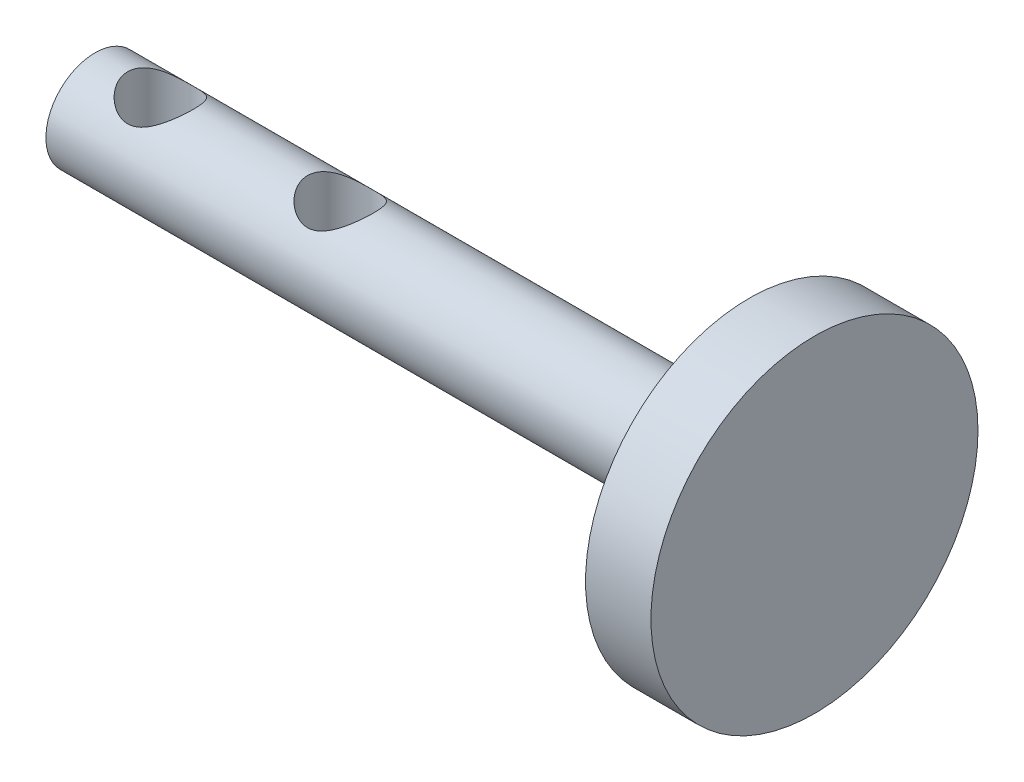
ISO-10303-21;
HEADER;
FILE_DESCRIPTION(('STEP AP214'),'2;1');
FILE_NAME('part.step','',(''),(''),'','','');
FILE_SCHEMA(('AUTOMOTIVE_DESIGN { 1 0 10303 214 1 1 1 1 }'));
ENDSEC;
DATA;
#1=APPLICATION_CONTEXT('core data for automotive mechanical design processes');
#2=APPLICATION_PROTOCOL_DEFINITION('international standard','automotive_design',2000,#1);
#3=PRODUCT_CONTEXT('',#1,'mechanical');
#4=PRODUCT('Part','Part','',(#3));
#5=PRODUCT_RELATED_PRODUCT_CATEGORY('part','',(#4));
#6=PRODUCT_DEFINITION_FORMATION('','',#4);
#7=PRODUCT_DEFINITION_CONTEXT('part definition',#1,'design');
#8=PRODUCT_DEFINITION('design','',#6,#7);
#9=PRODUCT_DEFINITION_SHAPE('','',#8);
#10=(LENGTH_UNIT() NAMED_UNIT(*) SI_UNIT(.MILLI.,.METRE.));
#11=(NAMED_UNIT(*) PLANE_ANGLE_UNIT() SI_UNIT($,.RADIAN.));
#12=(NAMED_UNIT(*) SI_UNIT($,.STERADIAN.) SOLID_ANGLE_UNIT());
#13=UNCERTAINTY_MEASURE_WITH_UNIT(LENGTH_MEASURE(1.E-05),#10,'distance_accuracy_value','');
#14=(GEOMETRIC_REPRESENTATION_CONTEXT(3) GLOBAL_UNCERTAINTY_ASSIGNED_CONTEXT((#13)) GLOBAL_UNIT_ASSIGNED_CONTEXT((#10,
#11,#12)) REPRESENTATION_CONTEXT('',''));
#15=CARTESIAN_POINT('',(0.,0.,0.));
#16=DIRECTION('',(0.,0.,1.));
#17=DIRECTION('',(1.,0.,0.));
#18=AXIS2_PLACEMENT_3D('',#15,#16,#17);
#19=CARTESIAN_POINT('',(20.,0.,0.));
#20=DIRECTION('',(-1.,0.,0.));
#21=DIRECTION('',(0.,0.,1.));
#22=AXIS2_PLACEMENT_3D('',#19,#20,#21);
#23=CYLINDRICAL_SURFACE('',#22,1.5);
#24=CARTESIAN_POINT('',(2.,-1.1180339887499,1.));
#25=CARTESIAN_POINT('',(2.04881415543431,-1.11803876731408,0.999997269988656));
#26=CARTESIAN_POINT('',(2.0976453768544,-1.12129035523721,0.99639496251832));
#27=CARTESIAN_POINT('',(2.19355995582541,-1.13365986250808,0.982291341588655));
#28=CARTESIAN_POINT('',(2.24064001776478,-1.14278830406355,0.971777652939312));
#29=CARTESIAN_POINT('',(2.33136772093884,-1.16528292912785,0.94467930838316));
#30=CARTESIAN_POINT('',(2.37504384836883,-1.17860780897301,0.92815359007107));
#31=CARTESIAN_POINT('',(2.45893291617333,-1.20792047340913,0.889670041967692));
#32=CARTESIAN_POINT('',(2.49914513498824,-1.22390881079415,0.867711084060814));
#33=CARTESIAN_POINT('',(2.58182344380845,-1.25973036466013,0.815012050038569));
#34=CARTESIAN_POINT('',(2.6236660588586,-1.27977468045182,0.783437177258661));
#35=CARTESIAN_POINT('',(2.70200135443714,-1.31972413654041,0.7140960987034));
#36=CARTESIAN_POINT('',(2.73848876082926,-1.33962912148992,0.676323865885401));
#37=CARTESIAN_POINT('',(2.81032182939083,-1.38044409261874,0.589078452471478));
#38=CARTESIAN_POINT('',(2.84474125588784,-1.40108392923461,0.538703219829095));
#39=CARTESIAN_POINT('',(2.90432104774504,-1.43779242241382,0.431235482106116));
#40=CARTESIAN_POINT('',(2.9294917570156,-1.45386618115518,0.374150576160852));
#41=CARTESIAN_POINT('',(2.96677820050873,-1.47799953732363,0.261624536740002));
#42=CARTESIAN_POINT('',(2.98004167224778,-1.48675587807934,0.206717362590708));
#43=CARTESIAN_POINT('',(2.99709224464182,-1.49804872730961,0.0948477243649312));
#44=CARTESIAN_POINT('',(3.00089127961272,-1.5005930688118,0.0378879406429128));
#45=CARTESIAN_POINT('',(2.99891377502547,-1.49927680861477,-0.0670735251161645));
#46=CARTESIAN_POINT('',(2.99450547434147,-1.49633132455064,-0.115120319004376));
#47=CARTESIAN_POINT('',(2.97895447432055,-1.4860409139501,-0.209619316635508));
#48=CARTESIAN_POINT('',(2.96781128384823,-1.47869566656551,-0.256071403824862));
#49=CARTESIAN_POINT('',(2.93940215760271,-1.46026045851868,-0.346038968835584));
#50=CARTESIAN_POINT('',(2.92216055740072,-1.44918538991339,-0.389565311922981));
#51=CARTESIAN_POINT('',(2.88222317852359,-1.42410552238144,-0.473104575326778));
#52=CARTESIAN_POINT('',(2.85952640424924,-1.41010018872581,-0.513116852484701));
#53=CARTESIAN_POINT('',(2.80601063127005,-1.37809029225351,-0.59414214598172));
#54=CARTESIAN_POINT('',(2.77451623832361,-1.35980204396013,-0.634595740498538));
#55=CARTESIAN_POINT('',(2.70605066025984,-1.32200300913499,-0.709994037491523));
#56=CARTESIAN_POINT('',(2.66907102703309,-1.30249036407616,-0.744930067597284));
#57=CARTESIAN_POINT('',(2.58401839489336,-1.26075022472076,-0.813861176630826));
#58=CARTESIAN_POINT('',(2.53511446014276,-1.23857160004468,-0.846867965631777));
#59=CARTESIAN_POINT('',(2.43124508038964,-1.19737805415546,-0.904174374727408));
#60=CARTESIAN_POINT('',(2.37629000279303,-1.17835785767438,-0.92848859327447));
#61=CARTESIAN_POINT('',(2.27764046896346,-1.15131435153449,-0.961663622838891));
#62=CARTESIAN_POINT('',(2.23520331497161,-1.1417018228885,-0.972953958737704));
#63=CARTESIAN_POINT('',(2.14848025509154,-1.1270451989479,-0.98989777790003));
#64=CARTESIAN_POINT('',(2.10419769441354,-1.12199318391119,-0.995561034821826));
#65=CARTESIAN_POINT('',(2.01477850677941,-1.11723778493745,-1.00089700074453));
#66=CARTESIAN_POINT('',(1.96963901074052,-1.11755766933454,-1.00054364876605));
#67=CARTESIAN_POINT('',(1.8801580830219,-1.12354940184257,-0.993808148581262));
#68=CARTESIAN_POINT('',(1.83581732794414,-1.12922558823607,-0.987421113449807));
#69=CARTESIAN_POINT('',(1.75130529122714,-1.14463988751152,-0.969499055937227));
#70=CARTESIAN_POINT('',(1.71103614550622,-1.15416593537715,-0.958230872657146));
#71=CARTESIAN_POINT('',(1.63293688196734,-1.17614979263984,-0.931115208135283));
#72=CARTESIAN_POINT('',(1.5951075884905,-1.18860858636727,-0.915266188999619));
#73=CARTESIAN_POINT('',(1.51489899811163,-1.21805741810736,-0.875816733031264));
#74=CARTESIAN_POINT('',(1.47312159436905,-1.23545540768822,-0.851300144226031));
#75=CARTESIAN_POINT('',(1.39379159883503,-1.27131257456476,-0.79676365764559));
#76=CARTESIAN_POINT('',(1.35624424167058,-1.2897730248931,-0.76673705945938));
#77=CARTESIAN_POINT('',(1.27801882621476,-1.33037839141598,-0.694383288512649));
#78=CARTESIAN_POINT('',(1.23844857586215,-1.35244726064259,-0.650801932557864));
#79=CARTESIAN_POINT('',(1.16709165854353,-1.39387790925842,-0.556549744344257));
#80=CARTESIAN_POINT('',(1.13529811437494,-1.41324207395941,-0.505885238731679));
#81=CARTESIAN_POINT('',(1.08605413053854,-1.44395410620131,-0.408743737408334));
#82=CARTESIAN_POINT('',(1.0670217477791,-1.45612729055242,-0.363331182442474));
#83=CARTESIAN_POINT('',(1.03569640284049,-1.47639353933783,-0.269378539510946));
#84=CARTESIAN_POINT('',(1.02339774857031,-1.48449004936067,-0.220841131929571));
#85=CARTESIAN_POINT('',(1.00615151808043,-1.49589182013302,-0.121684696151538));
#86=CARTESIAN_POINT('',(1.00123666024661,-1.49917575428247,-0.0710574184621111));
#87=CARTESIAN_POINT('',(0.999176074291499,-1.50054910514547,0.0304277732903151));
#88=CARTESIAN_POINT('',(1.00202962402193,-1.49863900469456,0.0812856654767095));
#89=CARTESIAN_POINT('',(1.01482974450234,-1.49014777988657,0.177878766264063));
#90=CARTESIAN_POINT('',(1.0242454924309,-1.48391638604927,0.223717571535267));
#91=CARTESIAN_POINT('',(1.04911900471545,-1.46768053103468,0.313009211498526));
#92=CARTESIAN_POINT('',(1.06457770767363,-1.45767548373552,0.356461674343443));
#93=CARTESIAN_POINT('',(1.10196935244201,-1.43395882743097,0.442573648304175));
#94=CARTESIAN_POINT('',(1.12422515374754,-1.42006624473169,0.485041794600131));
#95=CARTESIAN_POINT('',(1.17407532231299,-1.38987704117736,0.56577633134159));
#96=CARTESIAN_POINT('',(1.201672883976,-1.37357898322632,0.604040186025008));
#97=CARTESIAN_POINT('',(1.26631445116815,-1.33696465736197,0.681647111007009));
#98=CARTESIAN_POINT('',(1.30416151183702,-1.31641956938685,0.720213397630455));
#99=CARTESIAN_POINT('',(1.38555677077292,-1.27526678824743,0.790800111407977));
#100=CARTESIAN_POINT('',(1.42910919441705,-1.25465905985077,0.822815641619615));
#101=CARTESIAN_POINT('',(1.51793379537764,-1.21692106795149,0.877566267592055));
#102=CARTESIAN_POINT('',(1.56282090497517,-1.19964543370952,0.90082323448605));
#103=CARTESIAN_POINT('',(1.65664222449658,-1.16873750795511,0.940579011701362));
#104=CARTESIAN_POINT('',(1.70556834693108,-1.15509815647652,0.957090951406665));
#105=CARTESIAN_POINT('',(1.79538573421227,-1.1359552596477,0.979681312354539));
#106=CARTESIAN_POINT('',(1.83565411839515,-1.12931847705076,0.987261141866242));
#107=CARTESIAN_POINT('',(1.91727820025227,-1.12035759608004,0.997419579094631));
#108=CARTESIAN_POINT('',(1.95863297213029,-1.11802993920738,1.00000231351858));
#109=CARTESIAN_POINT('',(2.,-1.1180339887499,1.));
#110=B_SPLINE_CURVE_WITH_KNOTS('',3,(#24,#25,#26,#27,#28,#29,#30,#31,#32,#33,#34,#35,#36,#37,
#38,#39,#40,#41,#42,#43,#44,#45,#46,#47,#48,#49,#50,#51,#52,#53,#54,#55,#56,#57,#58,#59,#60,#61,
#62,#63,#64,#65,#66,#67,#68,#69,#70,#71,#72,#73,#74,#75,#76,#77,#78,#79,#80,#81,#82,#83,#84,#85,
#86,#87,#88,#89,#90,#91,#92,#93,#94,#95,#96,#97,#98,#99,#100,#101,#102,#103,#104,#105,#106,#107,
#108,#109),.UNSPECIFIED.,.T.,.F.,(4,2,2,2,2,2,2,2,2,2,2,2,2,2,2,2,2,2,2,2,2,2,2,2,2,2,2,2,2,2,2,
2,2,2,2,2,2,2,2,2,2,2,4),(0.,0.146253465361076,0.292769521129644,0.437886325608137,
0.583033286332745,0.750773385343188,0.918677592181377,1.11083515503145,1.3027771469429,
1.4731874103179,1.64338268344149,1.78769767477871,1.93202319141873,2.07577915986595,
2.219561384515,2.38223762973317,2.54516707398319,2.73339351752472,2.92130234871974,
3.05563045200662,3.18972483117743,3.32440018819018,3.45918471785299,3.58738225853468,
3.71562288822479,3.86949615025543,4.0235577839993,4.21127342259657,4.39882245285466,
4.55035290305025,4.70175506443412,4.85382614632258,5.00588309222248,5.1468839112404,
5.28790663945594,5.43708931492125,5.58636147964719,5.75911103141433,5.93198925208478,
6.09167062897535,6.25103968323789,6.37508308151304,6.49902399831892),.UNSPECIFIED.);
#111=CARTESIAN_POINT('',(2.,-1.1180339887499,1.));
#112=VERTEX_POINT('',#111);
#113=EDGE_CURVE('E39',#112,#112,#110,.T.);
#114=ORIENTED_EDGE('',*,*,#113,.T.);
#115=EDGE_LOOP('',(#114));
#116=FACE_BOUND('',#115,.T.);
#117=CARTESIAN_POINT('',(2.,1.1180339887499,1.));
#118=CARTESIAN_POINT('',(1.95118584456569,1.11803876731408,0.999997269988656));
#119=CARTESIAN_POINT('',(1.9023546231456,1.12129035523721,0.99639496251832));
#120=CARTESIAN_POINT('',(1.80644004417459,1.13365986250808,0.982291341588655));
#121=CARTESIAN_POINT('',(1.75935998223522,1.14278830406355,0.971777652939312));
#122=CARTESIAN_POINT('',(1.66863227906116,1.16528292912785,0.94467930838316));
#123=CARTESIAN_POINT('',(1.62495615163117,1.17860780897301,0.92815359007107));
#124=CARTESIAN_POINT('',(1.54106708382667,1.20792047340913,0.889670041967692));
#125=CARTESIAN_POINT('',(1.50085486501176,1.22390881079415,0.867711084060814));
#126=CARTESIAN_POINT('',(1.41817655619155,1.25973036466013,0.815012050038568));
#127=CARTESIAN_POINT('',(1.3763339411414,1.27977468045182,0.783437177258661));
#128=CARTESIAN_POINT('',(1.29799864556286,1.31972413654041,0.714096098703399));
#129=CARTESIAN_POINT('',(1.26151123917074,1.33962912148992,0.6763238658854));
#130=CARTESIAN_POINT('',(1.18967817060917,1.38044409261874,0.589078452471477));
#131=CARTESIAN_POINT('',(1.15525874411216,1.40108392923461,0.538703219829095));
#132=CARTESIAN_POINT('',(1.09567895225496,1.43779242241382,0.431235482106116));
#133=CARTESIAN_POINT('',(1.0705082429844,1.45386618115518,0.374150576160852));
#134=CARTESIAN_POINT('',(1.03322179949127,1.47799953732363,0.261624536740001));
#135=CARTESIAN_POINT('',(1.01995832775222,1.48675587807934,0.206717362590708));
#136=CARTESIAN_POINT('',(1.00290775535818,1.49804872730961,0.0948477243649308));
#137=CARTESIAN_POINT('',(0.999108720387279,1.5005930688118,0.0378879406429124));
#138=CARTESIAN_POINT('',(1.00108622497453,1.49927680861477,-0.0670735251161649));
#139=CARTESIAN_POINT('',(1.00549452565853,1.49633132455064,-0.115120319004377));
#140=CARTESIAN_POINT('',(1.02104552567945,1.4860409139501,-0.209619316635508));
#141=CARTESIAN_POINT('',(1.03218871615177,1.47869566656551,-0.256071403824862));
#142=CARTESIAN_POINT('',(1.06059784239729,1.46026045851868,-0.346038968835585));
#143=CARTESIAN_POINT('',(1.07783944259928,1.44918538991339,-0.389565311922981));
#144=CARTESIAN_POINT('',(1.11777682147641,1.42410552238144,-0.473104575326778));
#145=CARTESIAN_POINT('',(1.14047359575076,1.41010018872581,-0.513116852484701));
#146=CARTESIAN_POINT('',(1.19398936872995,1.37809029225351,-0.59414214598172));
#147=CARTESIAN_POINT('',(1.22548376167639,1.35980204396012,-0.634595740498539));
#148=CARTESIAN_POINT('',(1.29394933974016,1.32200300913499,-0.709994037491523));
#149=CARTESIAN_POINT('',(1.33092897296691,1.30249036407616,-0.744930067597285));
#150=CARTESIAN_POINT('',(1.41598160510664,1.26075022472076,-0.813861176630826));
#151=CARTESIAN_POINT('',(1.46488553985724,1.23857160004468,-0.846867965631777));
#152=CARTESIAN_POINT('',(1.56875491961036,1.19737805415546,-0.904174374727408));
#153=CARTESIAN_POINT('',(1.62370999720697,1.17835785767438,-0.928488593274471));
#154=CARTESIAN_POINT('',(1.72235953103654,1.15131435153449,-0.961663622838891));
#155=CARTESIAN_POINT('',(1.7647966850284,1.1417018228885,-0.972953958737705));
#156=CARTESIAN_POINT('',(1.85151974490846,1.1270451989479,-0.98989777790003));
#157=CARTESIAN_POINT('',(1.89580230558646,1.12199318391119,-0.995561034821826));
#158=CARTESIAN_POINT('',(1.98522149322059,1.11723778493745,-1.00089700074453));
#159=CARTESIAN_POINT('',(2.03036098925948,1.11755766933454,-1.00054364876605));
#160=CARTESIAN_POINT('',(2.1198419169781,1.12354940184257,-0.993808148581262));
#161=CARTESIAN_POINT('',(2.16418267205586,1.12922558823607,-0.987421113449806));
#162=CARTESIAN_POINT('',(2.24869470877286,1.14463988751152,-0.969499055937226));
#163=CARTESIAN_POINT('',(2.28896385449378,1.15416593537715,-0.958230872657146));
#164=CARTESIAN_POINT('',(2.36706311803266,1.17614979263984,-0.931115208135282));
#165=CARTESIAN_POINT('',(2.4048924115095,1.18860858636727,-0.915266188999618));
#166=CARTESIAN_POINT('',(2.48510100188837,1.21805741810736,-0.875816733031263));
#167=CARTESIAN_POINT('',(2.52687840563095,1.23545540768822,-0.851300144226031));
#168=CARTESIAN_POINT('',(2.60620840116498,1.27131257456476,-0.79676365764559));
#169=CARTESIAN_POINT('',(2.64375575832942,1.2897730248931,-0.766737059459379));
#170=CARTESIAN_POINT('',(2.72198117378524,1.33037839141598,-0.694383288512648));
#171=CARTESIAN_POINT('',(2.76155142413785,1.35244726064259,-0.650801932557862));
#172=CARTESIAN_POINT('',(2.83290834145647,1.39387790925842,-0.556549744344254));
#173=CARTESIAN_POINT('',(2.86470188562506,1.41324207395941,-0.505885238731677));
#174=CARTESIAN_POINT('',(2.91394586946146,1.44395410620131,-0.408743737408332));
#175=CARTESIAN_POINT('',(2.9329782522209,1.45612729055242,-0.363331182442473));
#176=CARTESIAN_POINT('',(2.96430359715951,1.47639353933783,-0.269378539510944));
#177=CARTESIAN_POINT('',(2.97660225142969,1.48449004936067,-0.220841131929569));
#178=CARTESIAN_POINT('',(2.99384848191957,1.49589182013302,-0.121684696151536));
#179=CARTESIAN_POINT('',(2.99876333975339,1.49917575428247,-0.0710574184621097));
#180=CARTESIAN_POINT('',(3.0008239257085,1.50054910514547,0.0304277732903163));
#181=CARTESIAN_POINT('',(2.99797037597807,1.49863900469456,0.081285665476711));
#182=CARTESIAN_POINT('',(2.98517025549766,1.49014777988657,0.177878766264065));
#183=CARTESIAN_POINT('',(2.9757545075691,1.48391638604927,0.223717571535269));
#184=CARTESIAN_POINT('',(2.95088099528455,1.46768053103468,0.313009211498528));
#185=CARTESIAN_POINT('',(2.93542229232637,1.45767548373552,0.356461674343444));
#186=CARTESIAN_POINT('',(2.89803064755799,1.43395882743097,0.442573648304176));
#187=CARTESIAN_POINT('',(2.87577484625246,1.42006624473169,0.485041794600133));
#188=CARTESIAN_POINT('',(2.82592467768701,1.38987704117736,0.565776331341591));
#189=CARTESIAN_POINT('',(2.798327116024,1.37357898322632,0.604040186025009));
#190=CARTESIAN_POINT('',(2.73368554883184,1.33696465736197,0.68164711100701));
#191=CARTESIAN_POINT('',(2.69583848816298,1.31641956938685,0.720213397630456));
#192=CARTESIAN_POINT('',(2.61444322922708,1.27526678824743,0.790800111407978));
#193=CARTESIAN_POINT('',(2.57089080558295,1.25465905985077,0.822815641619616));
#194=CARTESIAN_POINT('',(2.48206620462235,1.21692106795149,0.877566267592056));
#195=CARTESIAN_POINT('',(2.43717909502483,1.19964543370952,0.90082323448605));
#196=CARTESIAN_POINT('',(2.34335777550342,1.16873750795511,0.940579011701362));
#197=CARTESIAN_POINT('',(2.29443165306892,1.15509815647652,0.957090951406666));
#198=CARTESIAN_POINT('',(2.20461426578773,1.1359552596477,0.979681312354539));
#199=CARTESIAN_POINT('',(2.16434588160485,1.12931847705076,0.987261141866242));
#200=CARTESIAN_POINT('',(2.08272179974773,1.12035759608004,0.997419579094631));
#201=CARTESIAN_POINT('',(2.04136702786971,1.11802993920738,1.00000231351858));
#202=CARTESIAN_POINT('',(2.,1.1180339887499,1.));
#203=B_SPLINE_CURVE_WITH_KNOTS('',3,(#117,#118,#119,#120,#121,#122,#123,#124,#125,#126,#127,
#128,#129,#130,#131,#132,#133,#134,#135,#136,#137,#138,#139,#140,#141,#142,#143,#144,#145,#146,
#147,#148,#149,#150,#151,#152,#153,#154,#155,#156,#157,#158,#159,#160,#161,#162,#163,#164,#165,
#166,#167,#168,#169,#170,#171,#172,#173,#174,#175,#176,#177,#178,#179,#180,#181,#182,#183,#184,
#185,#186,#187,#188,#189,#190,#191,#192,#193,#194,#195,#196,#197,#198,#199,#200,#201,#202),
.UNSPECIFIED.,.T.,.F.,(4,2,2,2,2,2,2,2,2,2,2,2,2,2,2,2,2,2,2,2,2,2,2,2,2,2,2,2,2,2,2,2,2,2,2,2,
2,2,2,2,2,2,4),(0.,0.146253465361076,0.292769521129644,0.437886325608137,0.583033286332745,
0.750773385343188,0.918677592181377,1.11083515503145,1.3027771469429,1.4731874103179,
1.64338268344149,1.78769767477871,1.93202319141873,2.07577915986595,2.219561384515,
2.38223762973317,2.54516707398319,2.73339351752472,2.92130234871974,3.05563045200662,
3.18972483117743,3.32440018819018,3.45918471785299,3.58738225853468,3.71562288822479,
3.86949615025543,4.0235577839993,4.21127342259657,4.39882245285466,4.55035290305025,
4.70175506443412,4.85382614632258,5.00588309222248,5.1468839112404,5.28790663945594,
5.43708931492125,5.58636147964719,5.75911103141433,5.93198925208478,6.09167062897535,
6.25103968323789,6.37508308151304,6.49902399831892),.UNSPECIFIED.);
#204=CARTESIAN_POINT('',(2.,1.1180339887499,1.));
#205=VERTEX_POINT('',#204);
#206=EDGE_CURVE('E104',#205,#205,#203,.T.);
#207=ORIENTED_EDGE('',*,*,#206,.T.);
#208=EDGE_LOOP('',(#207));
#209=FACE_BOUND('',#208,.T.);
#210=CARTESIAN_POINT('',(7.5,-1.11803398874989,1.));
#211=CARTESIAN_POINT('',(7.54881415543431,-1.11803876731408,0.999997269988657));
#212=CARTESIAN_POINT('',(7.5976453768544,-1.12129035523721,0.996394962518322));
#213=CARTESIAN_POINT('',(7.69355995582541,-1.13365986250808,0.982291341588656));
#214=CARTESIAN_POINT('',(7.74064001776478,-1.14278830406355,0.971777652939313));
#215=CARTESIAN_POINT('',(7.83136772093884,-1.16528292912785,0.944679308383161));
#216=CARTESIAN_POINT('',(7.87504384836883,-1.17860780897301,0.928153590071071));
#217=CARTESIAN_POINT('',(7.95893291617333,-1.20792047340913,0.889670041967693));
#218=CARTESIAN_POINT('',(7.99914513498824,-1.22390881079415,0.867711084060815));
#219=CARTESIAN_POINT('',(8.08182344380845,-1.25973036466013,0.815012050038569));
#220=CARTESIAN_POINT('',(8.1236660588586,-1.27977468045182,0.783437177258662));
#221=CARTESIAN_POINT('',(8.20200135443714,-1.31972413654041,0.7140960987034));
#222=CARTESIAN_POINT('',(8.23848876082926,-1.33962912148992,0.676323865885401));
#223=CARTESIAN_POINT('',(8.31032182939084,-1.38044409261874,0.589078452471478));
#224=CARTESIAN_POINT('',(8.34474125588784,-1.40108392923461,0.538703219829095));
#225=CARTESIAN_POINT('',(8.40432104774504,-1.43779242241382,0.431235482106116));
#226=CARTESIAN_POINT('',(8.4294917570156,-1.45386618115518,0.374150576160852));
#227=CARTESIAN_POINT('',(8.46677820050873,-1.47799953732363,0.261624536740002));
#228=CARTESIAN_POINT('',(8.48004167224778,-1.48675587807934,0.206717362590708));
#229=CARTESIAN_POINT('',(8.49709224464183,-1.49804872730961,0.0948477243649311));
#230=CARTESIAN_POINT('',(8.50089127961272,-1.5005930688118,0.0378879406429125));
#231=CARTESIAN_POINT('',(8.49891377502547,-1.49927680861477,-0.0670735251161649));
#232=CARTESIAN_POINT('',(8.49450547434147,-1.49633132455064,-0.115120319004377));
#233=CARTESIAN_POINT('',(8.47895447432055,-1.4860409139501,-0.209619316635508));
#234=CARTESIAN_POINT('',(8.46781128384823,-1.47869566656551,-0.256071403824862));
#235=CARTESIAN_POINT('',(8.43940215760271,-1.46026045851868,-0.346038968835585));
#236=CARTESIAN_POINT('',(8.42216055740072,-1.44918538991339,-0.389565311922981));
#237=CARTESIAN_POINT('',(8.38222317852359,-1.42410552238144,-0.473104575326779));
#238=CARTESIAN_POINT('',(8.35952640424925,-1.41010018872581,-0.513116852484702));
#239=CARTESIAN_POINT('',(8.30601063127006,-1.37809029225351,-0.594142145981721));
#240=CARTESIAN_POINT('',(8.27451623832361,-1.35980204396012,-0.634595740498539));
#241=CARTESIAN_POINT('',(8.20605066025984,-1.32200300913499,-0.709994037491524));
#242=CARTESIAN_POINT('',(8.16907102703309,-1.30249036407615,-0.744930067597285));
#243=CARTESIAN_POINT('',(8.08401839489336,-1.26075022472076,-0.813861176630827));
#244=CARTESIAN_POINT('',(8.03511446014276,-1.23857160004468,-0.846867965631778));
#245=CARTESIAN_POINT('',(7.93124508038964,-1.19737805415546,-0.904174374727409));
#246=CARTESIAN_POINT('',(7.87629000279303,-1.17835785767438,-0.928488593274472));
#247=CARTESIAN_POINT('',(7.77764046896346,-1.15131435153449,-0.961663622838892));
#248=CARTESIAN_POINT('',(7.7352033149716,-1.14170182288849,-0.972953958737706));
#249=CARTESIAN_POINT('',(7.64848025509154,-1.1270451989479,-0.989897777900031));
#250=CARTESIAN_POINT('',(7.60419769441354,-1.12199318391118,-0.995561034821827));
#251=CARTESIAN_POINT('',(7.51477850677941,-1.11723778493745,-1.00089700074454));
#252=CARTESIAN_POINT('',(7.46963901074052,-1.11755766933454,-1.00054364876605));
#253=CARTESIAN_POINT('',(7.3801580830219,-1.12354940184257,-0.993808148581264));
#254=CARTESIAN_POINT('',(7.33581732794414,-1.12922558823606,-0.987421113449808));
#255=CARTESIAN_POINT('',(7.25130529122714,-1.14463988751152,-0.969499055937228));
#256=CARTESIAN_POINT('',(7.21103614550622,-1.15416593537715,-0.958230872657147));
#257=CARTESIAN_POINT('',(7.13293688196734,-1.17614979263984,-0.931115208135284));
#258=CARTESIAN_POINT('',(7.0951075884905,-1.18860858636727,-0.91526618899962));
#259=CARTESIAN_POINT('',(7.01489899811162,-1.21805741810736,-0.875816733031264));
#260=CARTESIAN_POINT('',(6.97312159436905,-1.23545540768822,-0.851300144226032));
#261=CARTESIAN_POINT('',(6.89379159883502,-1.27131257456476,-0.79676365764559));
#262=CARTESIAN_POINT('',(6.85624424167058,-1.2897730248931,-0.76673705945938));
#263=CARTESIAN_POINT('',(6.77801882621476,-1.33037839141598,-0.694383288512649));
#264=CARTESIAN_POINT('',(6.73844857586215,-1.35244726064259,-0.650801932557863));
#265=CARTESIAN_POINT('',(6.66709165854353,-1.39387790925842,-0.556549744344256));
#266=CARTESIAN_POINT('',(6.63529811437494,-1.41324207395941,-0.505885238731678));
#267=CARTESIAN_POINT('',(6.58605413053854,-1.44395410620131,-0.408743737408333));
#268=CARTESIAN_POINT('',(6.5670217477791,-1.45612729055242,-0.363331182442473));
#269=CARTESIAN_POINT('',(6.53569640284049,-1.47639353933783,-0.269378539510944));
#270=CARTESIAN_POINT('',(6.52339774857031,-1.48449004936067,-0.220841131929569));
#271=CARTESIAN_POINT('',(6.50615151808043,-1.49589182013302,-0.121684696151536));
#272=CARTESIAN_POINT('',(6.50123666024661,-1.49917575428247,-0.0710574184621094));
#273=CARTESIAN_POINT('',(6.4991760742915,-1.50054910514547,0.0304277732903167));
#274=CARTESIAN_POINT('',(6.50202962402192,-1.49863900469456,0.0812856654767112));
#275=CARTESIAN_POINT('',(6.51482974450234,-1.49014777988657,0.177878766264065));
#276=CARTESIAN_POINT('',(6.5242454924309,-1.48391638604927,0.223717571535268));
#277=CARTESIAN_POINT('',(6.54911900471545,-1.46768053103468,0.313009211498528));
#278=CARTESIAN_POINT('',(6.56457770767363,-1.45767548373552,0.356461674343444));
#279=CARTESIAN_POINT('',(6.60196935244201,-1.43395882743097,0.442573648304177));
#280=CARTESIAN_POINT('',(6.62422515374754,-1.42006624473169,0.485041794600133));
#281=CARTESIAN_POINT('',(6.67407532231299,-1.38987704117736,0.565776331341591));
#282=CARTESIAN_POINT('',(6.701672883976,-1.37357898322632,0.60404018602501));
#283=CARTESIAN_POINT('',(6.76631445116815,-1.33696465736197,0.681647111007011));
#284=CARTESIAN_POINT('',(6.80416151183702,-1.31641956938685,0.720213397630457));
#285=CARTESIAN_POINT('',(6.88555677077292,-1.27526678824743,0.790800111407979));
#286=CARTESIAN_POINT('',(6.92910919441705,-1.25465905985077,0.822815641619617));
#287=CARTESIAN_POINT('',(7.01793379537765,-1.21692106795149,0.877566267592057));
#288=CARTESIAN_POINT('',(7.06282090497517,-1.19964543370952,0.900823234486052));
#289=CARTESIAN_POINT('',(7.15664222449658,-1.16873750795511,0.940579011701364));
#290=CARTESIAN_POINT('',(7.20556834693108,-1.15509815647652,0.957090951406667));
#291=CARTESIAN_POINT('',(7.29538573421227,-1.1359552596477,0.979681312354541));
#292=CARTESIAN_POINT('',(7.33565411839515,-1.12931847705076,0.987261141866243));
#293=CARTESIAN_POINT('',(7.41727820025227,-1.12035759608004,0.997419579094632));
#294=CARTESIAN_POINT('',(7.45863297213029,-1.11802993920738,1.00000231351858));
#295=CARTESIAN_POINT('',(7.5,-1.11803398874989,1.));
#296=B_SPLINE_CURVE_WITH_KNOTS('',3,(#210,#211,#212,#213,#214,#215,#216,#217,#218,#219,#220,
#221,#222,#223,#224,#225,#226,#227,#228,#229,#230,#231,#232,#233,#234,#235,#236,#237,#238,#239,
#240,#241,#242,#243,#244,#245,#246,#247,#248,#249,#250,#251,#252,#253,#254,#255,#256,#257,#258,
#259,#260,#261,#262,#263,#264,#265,#266,#267,#268,#269,#270,#271,#272,#273,#274,#275,#276,#277,
#278,#279,#280,#281,#282,#283,#284,#285,#286,#287,#288,#289,#290,#291,#292,#293,#294,#295),
.UNSPECIFIED.,.T.,.F.,(4,2,2,2,2,2,2,2,2,2,2,2,2,2,2,2,2,2,2,2,2,2,2,2,2,2,2,2,2,2,2,2,2,2,2,2,
2,2,2,2,2,2,4),(0.,0.146253465361078,0.292769521129645,0.437886325608138,0.583033286332747,
0.75077338534319,0.918677592181379,1.11083515503145,1.3027771469429,1.4731874103179,
1.64338268344149,1.78769767477871,1.93202319141873,2.07577915986596,2.219561384515,
2.38223762973318,2.5451670739832,2.73339351752472,2.92130234871974,3.05563045200663,
3.18972483117744,3.32440018819019,3.45918471785299,3.58738225853468,3.71562288822479,
3.86949615025544,4.02355778399931,4.21127342259658,4.39882245285466,4.55035290305025,
4.70175506443412,4.85382614632259,5.00588309222249,5.1468839112404,5.28790663945595,
5.43708931492126,5.5863614796472,5.75911103141434,5.93198925208478,6.09167062897536,
6.2510396832379,6.37508308151304,6.49902399831893),.UNSPECIFIED.);
#297=CARTESIAN_POINT('',(7.5,-1.11803398874989,1.));
#298=VERTEX_POINT('',#297);
#299=EDGE_CURVE('E65',#298,#298,#296,.T.);
#300=ORIENTED_EDGE('',*,*,#299,.T.);
#301=EDGE_LOOP('',(#300));
#302=FACE_BOUND('',#301,.T.);
#303=CARTESIAN_POINT('',(7.5,1.11803398874989,1.));
#304=CARTESIAN_POINT('',(7.45118584456569,1.11803876731408,0.999997269988657));
#305=CARTESIAN_POINT('',(7.4023546231456,1.12129035523721,0.996394962518322));
#306=CARTESIAN_POINT('',(7.30644004417459,1.13365986250808,0.982291341588656));
#307=CARTESIAN_POINT('',(7.25935998223522,1.14278830406355,0.971777652939313));
#308=CARTESIAN_POINT('',(7.16863227906116,1.16528292912785,0.944679308383161));
#309=CARTESIAN_POINT('',(7.12495615163117,1.17860780897301,0.928153590071071));
#310=CARTESIAN_POINT('',(7.04106708382667,1.20792047340913,0.889670041967693));
#311=CARTESIAN_POINT('',(7.00085486501176,1.22390881079415,0.867711084060815));
#312=CARTESIAN_POINT('',(6.91817655619155,1.25973036466013,0.81501205003857));
#313=CARTESIAN_POINT('',(6.8763339411414,1.27977468045182,0.783437177258662));
#314=CARTESIAN_POINT('',(6.79799864556286,1.31972413654041,0.7140960987034));
#315=CARTESIAN_POINT('',(6.76151123917074,1.33962912148992,0.676323865885401));
#316=CARTESIAN_POINT('',(6.68967817060917,1.38044409261874,0.589078452471478));
#317=CARTESIAN_POINT('',(6.65525874411216,1.40108392923461,0.538703219829095));
#318=CARTESIAN_POINT('',(6.59567895225496,1.43779242241382,0.431235482106116));
#319=CARTESIAN_POINT('',(6.5705082429844,1.45386618115518,0.374150576160852));
#320=CARTESIAN_POINT('',(6.53322179949127,1.47799953732363,0.261624536740001));
#321=CARTESIAN_POINT('',(6.51995832775222,1.48675587807934,0.206717362590708));
#322=CARTESIAN_POINT('',(6.50290775535817,1.49804872730961,0.0948477243649306));
#323=CARTESIAN_POINT('',(6.49910872038728,1.5005930688118,0.0378879406429122));
#324=CARTESIAN_POINT('',(6.50108622497452,1.49927680861477,-0.0670735251161651));
#325=CARTESIAN_POINT('',(6.50549452565853,1.49633132455064,-0.115120319004377));
#326=CARTESIAN_POINT('',(6.52104552567945,1.4860409139501,-0.209619316635508));
#327=CARTESIAN_POINT('',(6.53218871615177,1.47869566656551,-0.256071403824862));
#328=CARTESIAN_POINT('',(6.56059784239729,1.46026045851868,-0.346038968835585));
#329=CARTESIAN_POINT('',(6.57783944259928,1.44918538991339,-0.389565311922981));
#330=CARTESIAN_POINT('',(6.61777682147641,1.42410552238144,-0.473104575326779));
#331=CARTESIAN_POINT('',(6.64047359575076,1.41010018872581,-0.513116852484702));
#332=CARTESIAN_POINT('',(6.69398936872995,1.37809029225351,-0.594142145981721));
#333=CARTESIAN_POINT('',(6.72548376167639,1.35980204396012,-0.63459574049854));
#334=CARTESIAN_POINT('',(6.79394933974016,1.32200300913499,-0.709994037491524));
#335=CARTESIAN_POINT('',(6.83092897296691,1.30249036407615,-0.744930067597285));
#336=CARTESIAN_POINT('',(6.91598160510664,1.26075022472076,-0.813861176630827));
#337=CARTESIAN_POINT('',(6.96488553985724,1.23857160004468,-0.846867965631777));
#338=CARTESIAN_POINT('',(7.06875491961036,1.19737805415546,-0.904174374727409));
#339=CARTESIAN_POINT('',(7.12370999720697,1.17835785767438,-0.928488593274472));
#340=CARTESIAN_POINT('',(7.22235953103654,1.15131435153449,-0.961663622838892));
#341=CARTESIAN_POINT('',(7.2647966850284,1.14170182288849,-0.972953958737706));
#342=CARTESIAN_POINT('',(7.35151974490846,1.1270451989479,-0.989897777900031));
#343=CARTESIAN_POINT('',(7.39580230558646,1.12199318391118,-0.995561034821827));
#344=CARTESIAN_POINT('',(7.48522149322059,1.11723778493745,-1.00089700074454));
#345=CARTESIAN_POINT('',(7.53036098925948,1.11755766933454,-1.00054364876605));
#346=CARTESIAN_POINT('',(7.6198419169781,1.12354940184257,-0.993808148581264));
#347=CARTESIAN_POINT('',(7.66418267205586,1.12922558823606,-0.987421113449808));
#348=CARTESIAN_POINT('',(7.74869470877286,1.14463988751152,-0.969499055937228));
#349=CARTESIAN_POINT('',(7.78896385449378,1.15416593537715,-0.958230872657147));
#350=CARTESIAN_POINT('',(7.86706311803266,1.17614979263984,-0.931115208135283));
#351=CARTESIAN_POINT('',(7.9048924115095,1.18860858636727,-0.915266188999619));
#352=CARTESIAN_POINT('',(7.98510100188837,1.21805741810736,-0.875816733031264));
#353=CARTESIAN_POINT('',(8.02687840563095,1.23545540768822,-0.851300144226032));
#354=CARTESIAN_POINT('',(8.10620840116498,1.27131257456476,-0.796763657645591));
#355=CARTESIAN_POINT('',(8.14375575832942,1.2897730248931,-0.76673705945938));
#356=CARTESIAN_POINT('',(8.22198117378524,1.33037839141598,-0.694383288512648));
#357=CARTESIAN_POINT('',(8.26155142413785,1.35244726064259,-0.650801932557863));
#358=CARTESIAN_POINT('',(8.33290834145647,1.39387790925842,-0.556549744344256));
#359=CARTESIAN_POINT('',(8.36470188562506,1.41324207395941,-0.505885238731678));
#360=CARTESIAN_POINT('',(8.41394586946146,1.44395410620131,-0.408743737408333));
#361=CARTESIAN_POINT('',(8.4329782522209,1.45612729055242,-0.363331182442473));
#362=CARTESIAN_POINT('',(8.46430359715951,1.47639353933783,-0.269378539510945));
#363=CARTESIAN_POINT('',(8.47660225142969,1.48449004936067,-0.220841131929569));
#364=CARTESIAN_POINT('',(8.49384848191957,1.49589182013302,-0.121684696151537));
#365=CARTESIAN_POINT('',(8.49876333975339,1.49917575428247,-0.0710574184621101));
#366=CARTESIAN_POINT('',(8.5008239257085,1.50054910514547,0.0304277732903161));
#367=CARTESIAN_POINT('',(8.49797037597808,1.49863900469456,0.0812856654767108));
#368=CARTESIAN_POINT('',(8.48517025549766,1.49014777988657,0.177878766264065));
#369=CARTESIAN_POINT('',(8.4757545075691,1.48391638604927,0.223717571535269));
#370=CARTESIAN_POINT('',(8.45088099528455,1.46768053103468,0.313009211498528));
#371=CARTESIAN_POINT('',(8.43542229232637,1.45767548373552,0.356461674343444));
#372=CARTESIAN_POINT('',(8.39803064755799,1.43395882743097,0.442573648304177));
#373=CARTESIAN_POINT('',(8.37577484625246,1.42006624473169,0.485041794600133));
#374=CARTESIAN_POINT('',(8.32592467768701,1.38987704117736,0.565776331341591));
#375=CARTESIAN_POINT('',(8.298327116024,1.37357898322632,0.60404018602501));
#376=CARTESIAN_POINT('',(8.23368554883185,1.33696465736197,0.68164711100701));
#377=CARTESIAN_POINT('',(8.19583848816298,1.31641956938685,0.720213397630456));
#378=CARTESIAN_POINT('',(8.11444322922708,1.27526678824743,0.790800111407978));
#379=CARTESIAN_POINT('',(8.07089080558296,1.25465905985077,0.822815641619616));
#380=CARTESIAN_POINT('',(7.98206620462236,1.21692106795149,0.877566267592056));
#381=CARTESIAN_POINT('',(7.93717909502483,1.19964543370952,0.900823234486051));
#382=CARTESIAN_POINT('',(7.84335777550342,1.16873750795511,0.940579011701363));
#383=CARTESIAN_POINT('',(7.79443165306892,1.15509815647652,0.957090951406667));
#384=CARTESIAN_POINT('',(7.70461426578773,1.1359552596477,0.979681312354541));
#385=CARTESIAN_POINT('',(7.66434588160485,1.12931847705076,0.987261141866243));
#386=CARTESIAN_POINT('',(7.58272179974773,1.12035759608004,0.997419579094632));
#387=CARTESIAN_POINT('',(7.54136702786971,1.11802993920738,1.00000231351858));
#388=CARTESIAN_POINT('',(7.5,1.11803398874989,1.));
#389=B_SPLINE_CURVE_WITH_KNOTS('',3,(#303,#304,#305,#306,#307,#308,#309,#310,#311,#312,#313,
#314,#315,#316,#317,#318,#319,#320,#321,#322,#323,#324,#325,#326,#327,#328,#329,#330,#331,#332,
#333,#334,#335,#336,#337,#338,#339,#340,#341,#342,#343,#344,#345,#346,#347,#348,#349,#350,#351,
#352,#353,#354,#355,#356,#357,#358,#359,#360,#361,#362,#363,#364,#365,#366,#367,#368,#369,#370,
#371,#372,#373,#374,#375,#376,#377,#378,#379,#380,#381,#382,#383,#384,#385,#386,#387,#388),
.UNSPECIFIED.,.T.,.F.,(4,2,2,2,2,2,2,2,2,2,2,2,2,2,2,2,2,2,2,2,2,2,2,2,2,2,2,2,2,2,2,2,2,2,2,2,
2,2,2,2,2,2,4),(0.,0.146253465361078,0.292769521129645,0.437886325608138,0.583033286332746,
0.750773385343189,0.918677592181379,1.11083515503145,1.3027771469429,1.4731874103179,
1.64338268344149,1.78769767477871,1.93202319141873,2.07577915986596,2.219561384515,
2.38223762973318,2.5451670739832,2.73339351752472,2.92130234871974,3.05563045200663,
3.18972483117744,3.32440018819019,3.45918471785299,3.58738225853469,3.71562288822479,
3.86949615025544,4.02355778399931,4.21127342259658,4.39882245285466,4.55035290305025,
4.70175506443412,4.85382614632258,5.00588309222249,5.14688391124041,5.28790663945595,
5.43708931492126,5.5863614796472,5.75911103141434,5.93198925208478,6.09167062897536,
6.2510396832379,6.37508308151304,6.49902399831893),.UNSPECIFIED.);
#390=CARTESIAN_POINT('',(7.5,1.11803398874989,1.));
#391=VERTEX_POINT('',#390);
#392=EDGE_CURVE('E58',#391,#391,#389,.T.);
#393=ORIENTED_EDGE('',*,*,#392,.T.);
#394=EDGE_LOOP('',(#393));
#395=FACE_BOUND('',#394,.T.);
#396=CARTESIAN_POINT('',(20.,0.,0.));
#397=DIRECTION('',(1.,0.,0.));
#398=DIRECTION('',(0.,0.,-1.));
#399=AXIS2_PLACEMENT_3D('',#396,#397,#398);
#400=CIRCLE('',#399,1.5);
#401=CARTESIAN_POINT('',(20.,0.,-1.5));
#402=VERTEX_POINT('',#401);
#403=EDGE_CURVE('E10',#402,#402,#400,.T.);
#404=ORIENTED_EDGE('',*,*,#403,.F.);
#405=EDGE_LOOP('',(#404));
#406=FACE_BOUND('',#405,.T.);
#407=CARTESIAN_POINT('',(0.,0.,0.));
#408=DIRECTION('',(1.,0.,0.));
#409=DIRECTION('',(0.,0.,-1.));
#410=AXIS2_PLACEMENT_3D('',#407,#408,#409);
#411=CIRCLE('',#410,1.5);
#412=CARTESIAN_POINT('',(0.,0.,-1.5));
#413=VERTEX_POINT('',#412);
#414=EDGE_CURVE('E47',#413,#413,#411,.T.);
#415=ORIENTED_EDGE('',*,*,#414,.T.);
#416=EDGE_LOOP('',(#415));
#417=FACE_BOUND('',#416,.T.);
#418=ADVANCED_FACE('F35',(#116,#209,#302,#395,#406,#417),#23,.T.);
#419=CARTESIAN_POINT('',(0.,0.,0.));
#420=DIRECTION('',(1.,0.,0.));
#421=DIRECTION('',(0.,0.,-1.));
#422=AXIS2_PLACEMENT_3D('',#419,#420,#421);
#423=PLANE('',#422);
#424=ORIENTED_EDGE('',*,*,#414,.F.);
#425=EDGE_LOOP('',(#424));
#426=FACE_BOUND('',#425,.T.);
#427=ADVANCED_FACE('F86',(#426),#423,.F.);
#428=CARTESIAN_POINT('',(22.,0.,0.));
#429=DIRECTION('',(-1.,0.,0.));
#430=DIRECTION('',(0.,0.,1.));
#431=AXIS2_PLACEMENT_3D('',#428,#429,#430);
#432=CYLINDRICAL_SURFACE('',#431,5.);
#433=CARTESIAN_POINT('',(22.,0.,0.));
#434=DIRECTION('',(1.,0.,0.));
#435=DIRECTION('',(0.,0.,-1.));
#436=AXIS2_PLACEMENT_3D('',#433,#434,#435);
#437=CIRCLE('',#436,5.);
#438=CARTESIAN_POINT('',(22.,0.,-5.));
#439=VERTEX_POINT('',#438);
#440=EDGE_CURVE('E52',#439,#439,#437,.T.);
#441=ORIENTED_EDGE('',*,*,#440,.F.);
#442=EDGE_LOOP('',(#441));
#443=FACE_BOUND('',#442,.T.);
#444=CARTESIAN_POINT('',(20.,0.,0.));
#445=DIRECTION('',(1.,0.,0.));
#446=DIRECTION('',(0.,0.,-1.));
#447=AXIS2_PLACEMENT_3D('',#444,#445,#446);
#448=CIRCLE('',#447,5.);
#449=CARTESIAN_POINT('',(20.,0.,-5.));
#450=VERTEX_POINT('',#449);
#451=EDGE_CURVE('E55',#450,#450,#448,.T.);
#452=ORIENTED_EDGE('',*,*,#451,.T.);
#453=EDGE_LOOP('',(#452));
#454=FACE_BOUND('',#453,.T.);
#455=ADVANCED_FACE('F81',(#443,#454),#432,.T.);
#456=CARTESIAN_POINT('',(22.,0.,0.));
#457=DIRECTION('',(1.,0.,0.));
#458=DIRECTION('',(0.,0.,-1.));
#459=AXIS2_PLACEMENT_3D('',#456,#457,#458);
#460=PLANE('',#459);
#461=ORIENTED_EDGE('',*,*,#440,.T.);
#462=EDGE_LOOP('',(#461));
#463=FACE_BOUND('',#462,.T.);
#464=ADVANCED_FACE('F77',(#463),#460,.T.);
#465=CARTESIAN_POINT('',(20.,0.,0.));
#466=DIRECTION('',(1.,0.,0.));
#467=DIRECTION('',(0.,0.,-1.));
#468=AXIS2_PLACEMENT_3D('',#465,#466,#467);
#469=PLANE('',#468);
#470=ORIENTED_EDGE('',*,*,#403,.T.);
#471=EDGE_LOOP('',(#470));
#472=FACE_BOUND('',#471,.T.);
#473=ORIENTED_EDGE('',*,*,#451,.F.);
#474=EDGE_LOOP('',(#473));
#475=FACE_BOUND('',#474,.T.);
#476=ADVANCED_FACE('F74',(#472,#475),#469,.F.);
#477=CARTESIAN_POINT('',(7.5,-5.,0.));
#478=DIRECTION('',(0.,1.,0.));
#479=DIRECTION('',(0.,0.,1.));
#480=AXIS2_PLACEMENT_3D('',#477,#478,#479);
#481=CYLINDRICAL_SURFACE('',#480,1.);
#482=ORIENTED_EDGE('',*,*,#392,.F.);
#483=EDGE_LOOP('',(#482));
#484=FACE_BOUND('',#483,.T.);
#485=ORIENTED_EDGE('',*,*,#299,.F.);
#486=EDGE_LOOP('',(#485));
#487=FACE_BOUND('',#486,.T.);
#488=ADVANCED_FACE('F69',(#484,#487),#481,.F.);
#489=CARTESIAN_POINT('',(2.,-5.,0.));
#490=DIRECTION('',(0.,1.,0.));
#491=DIRECTION('',(0.,0.,1.));
#492=AXIS2_PLACEMENT_3D('',#489,#490,#491);
#493=CYLINDRICAL_SURFACE('',#492,1.);
#494=ORIENTED_EDGE('',*,*,#206,.F.);
#495=EDGE_LOOP('',(#494));
#496=FACE_BOUND('',#495,.T.);
#497=ORIENTED_EDGE('',*,*,#113,.F.);
#498=EDGE_LOOP('',(#497));
#499=FACE_BOUND('',#498,.T.);
#500=ADVANCED_FACE('F73',(#496,#499),#493,.F.);
#501=CLOSED_SHELL('',(#418,#427,#455,#464,#476,#488,#500));
#502=MANIFOLD_SOLID_BREP('B2',#501);
#503=ADVANCED_BREP_SHAPE_REPRESENTATION('',(#18,#502),#14);
#504=SHAPE_DEFINITION_REPRESENTATION(#9,#503);
ENDSEC;
END-ISO-10303-21;
